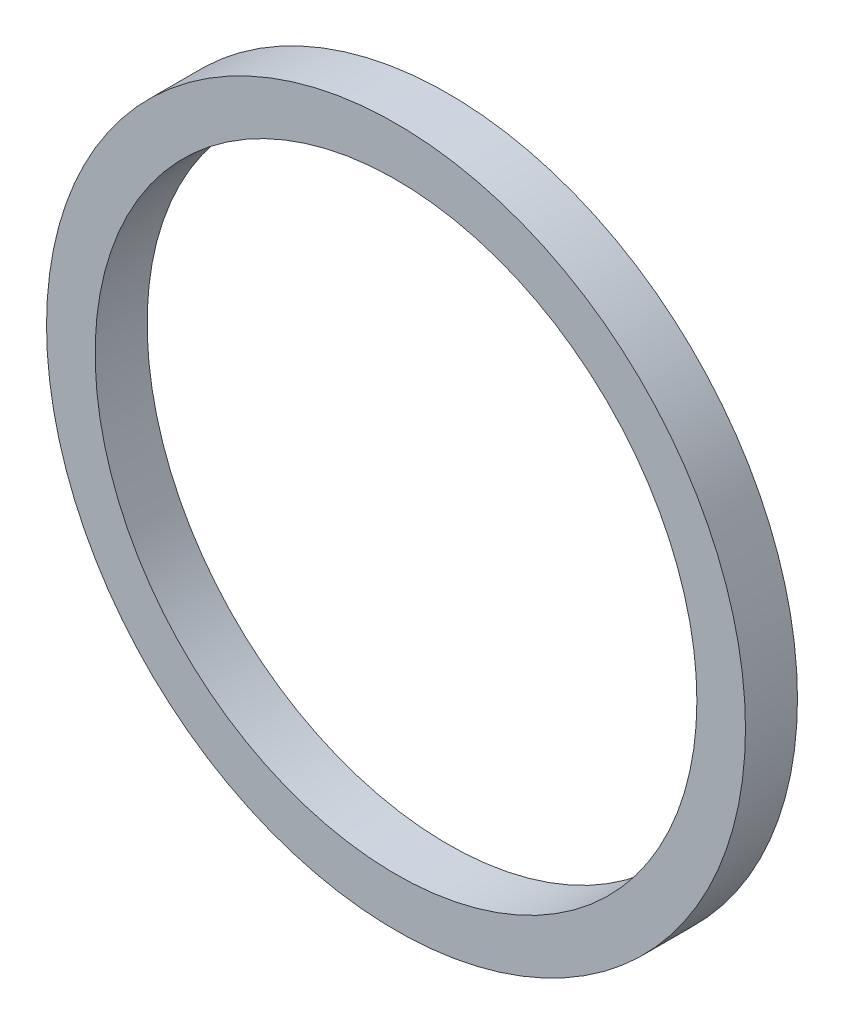
ISO-10303-21;
HEADER;
FILE_DESCRIPTION(('STEP AP214'),'2;1');
FILE_NAME('part.step','',(''),(''),'','','');
FILE_SCHEMA(('AUTOMOTIVE_DESIGN { 1 0 10303 214 1 1 1 1 }'));
ENDSEC;
DATA;
#1=APPLICATION_CONTEXT('core data for automotive mechanical design processes');
#2=APPLICATION_PROTOCOL_DEFINITION('international standard','automotive_design',2000,#1);
#3=PRODUCT_CONTEXT('',#1,'mechanical');
#4=PRODUCT('Part','Part','',(#3));
#5=PRODUCT_RELATED_PRODUCT_CATEGORY('part','',(#4));
#6=PRODUCT_DEFINITION_FORMATION('','',#4);
#7=PRODUCT_DEFINITION_CONTEXT('part definition',#1,'design');
#8=PRODUCT_DEFINITION('design','',#6,#7);
#9=PRODUCT_DEFINITION_SHAPE('','',#8);
#10=(LENGTH_UNIT() NAMED_UNIT(*) SI_UNIT(.MILLI.,.METRE.));
#11=(NAMED_UNIT(*) PLANE_ANGLE_UNIT() SI_UNIT($,.RADIAN.));
#12=(NAMED_UNIT(*) SI_UNIT($,.STERADIAN.) SOLID_ANGLE_UNIT());
#13=UNCERTAINTY_MEASURE_WITH_UNIT(LENGTH_MEASURE(1.E-05),#10,'distance_accuracy_value','');
#14=(GEOMETRIC_REPRESENTATION_CONTEXT(3) GLOBAL_UNCERTAINTY_ASSIGNED_CONTEXT((#13)) GLOBAL_UNIT_ASSIGNED_CONTEXT((#10,
#11,#12)) REPRESENTATION_CONTEXT('',''));
#15=CARTESIAN_POINT('',(0.,0.,0.));
#16=DIRECTION('',(0.,0.,1.));
#17=DIRECTION('',(1.,0.,0.));
#18=AXIS2_PLACEMENT_3D('',#15,#16,#17);
#19=CARTESIAN_POINT('',(0.,5.37362637362638,-0.862864380232569));
#20=DIRECTION('',(0.,0.,-1.));
#21=DIRECTION('',(-1.,0.,0.));
#22=AXIS2_PLACEMENT_3D('',#19,#20,#21);
#23=PLANE('',#22);
#24=CARTESIAN_POINT('',(0.,0.,-0.862864380232569));
#25=DIRECTION('',(0.,0.,1.));
#26=DIRECTION('',(1.,0.,0.));
#27=AXIS2_PLACEMENT_3D('',#24,#25,#26);
#28=CIRCLE('',#27,5.37362637362637);
#29=CARTESIAN_POINT('',(5.37362637362637,0.,-0.862864380232569));
#30=VERTEX_POINT('',#29);
#31=EDGE_CURVE('E18',#30,#30,#28,.F.);
#32=ORIENTED_EDGE('',*,*,#31,.F.);
#33=EDGE_LOOP('',(#32));
#34=FACE_BOUND('',#33,.T.);
#35=CARTESIAN_POINT('',(0.,0.,-0.862864380232569));
#36=DIRECTION('',(0.,0.,1.));
#37=DIRECTION('',(1.,0.,0.));
#38=AXIS2_PLACEMENT_3D('',#35,#36,#37);
#39=CIRCLE('',#38,4.62637362637363);
#40=CARTESIAN_POINT('',(4.62637362637363,0.,-0.862864380232569));
#41=VERTEX_POINT('',#40);
#42=EDGE_CURVE('E27',#41,#41,#39,.F.);
#43=ORIENTED_EDGE('',*,*,#42,.T.);
#44=EDGE_LOOP('',(#43));
#45=FACE_BOUND('',#44,.T.);
#46=ADVANCED_FACE('F15',(#34,#45),#23,.F.);
#47=CARTESIAN_POINT('',(0.,0.,1.75));
#48=DIRECTION('',(0.,0.,1.));
#49=DIRECTION('',(1.,0.,0.));
#50=AXIS2_PLACEMENT_3D('',#47,#48,#49);
#51=CYLINDRICAL_SURFACE('',#50,5.37362637362637);
#52=ORIENTED_EDGE('',*,*,#31,.T.);
#53=EDGE_LOOP('',(#52));
#54=FACE_BOUND('',#53,.T.);
#55=CARTESIAN_POINT('',(0.,0.,-1.6625));
#56=DIRECTION('',(0.,0.,1.));
#57=DIRECTION('',(1.,0.,0.));
#58=AXIS2_PLACEMENT_3D('',#55,#56,#57);
#59=CIRCLE('',#58,5.37362637362637);
#60=CARTESIAN_POINT('',(5.37362637362637,0.,-1.6625));
#61=VERTEX_POINT('',#60);
#62=EDGE_CURVE('E22',#61,#61,#59,.T.);
#63=ORIENTED_EDGE('',*,*,#62,.T.);
#64=EDGE_LOOP('',(#63));
#65=FACE_BOUND('',#64,.T.);
#66=ADVANCED_FACE('F35',(#54,#65),#51,.T.);
#67=CARTESIAN_POINT('',(0.,0.,1.75));
#68=DIRECTION('',(0.,0.,1.));
#69=DIRECTION('',(1.,0.,0.));
#70=AXIS2_PLACEMENT_3D('',#67,#68,#69);
#71=CYLINDRICAL_SURFACE('',#70,4.62637362637363);
#72=CARTESIAN_POINT('',(0.,0.,-1.6625));
#73=DIRECTION('',(0.,0.,1.));
#74=DIRECTION('',(1.,0.,0.));
#75=AXIS2_PLACEMENT_3D('',#72,#73,#74);
#76=CIRCLE('',#75,4.62637362637363);
#77=CARTESIAN_POINT('',(4.62637362637363,0.,-1.6625));
#78=VERTEX_POINT('',#77);
#79=EDGE_CURVE('E10',#78,#78,#76,.F.);
#80=ORIENTED_EDGE('',*,*,#79,.T.);
#81=EDGE_LOOP('',(#80));
#82=FACE_BOUND('',#81,.T.);
#83=ORIENTED_EDGE('',*,*,#42,.F.);
#84=EDGE_LOOP('',(#83));
#85=FACE_BOUND('',#84,.T.);
#86=ADVANCED_FACE('F43',(#82,#85),#71,.F.);
#87=CARTESIAN_POINT('',(0.,5.37362637362638,-1.6625));
#88=DIRECTION('',(0.,0.,1.));
#89=DIRECTION('',(1.,0.,0.));
#90=AXIS2_PLACEMENT_3D('',#87,#88,#89);
#91=PLANE('',#90);
#92=ORIENTED_EDGE('',*,*,#79,.F.);
#93=EDGE_LOOP('',(#92));
#94=FACE_BOUND('',#93,.T.);
#95=ORIENTED_EDGE('',*,*,#62,.F.);
#96=EDGE_LOOP('',(#95));
#97=FACE_BOUND('',#96,.T.);
#98=ADVANCED_FACE('F44',(#94,#97),#91,.F.);
#99=CLOSED_SHELL('',(#46,#66,#86,#98));
#100=MANIFOLD_SOLID_BREP('B1',#99);
#101=ADVANCED_BREP_SHAPE_REPRESENTATION('',(#18,#100),#14);
#102=SHAPE_DEFINITION_REPRESENTATION(#9,#101);
ENDSEC;
END-ISO-10303-21;
